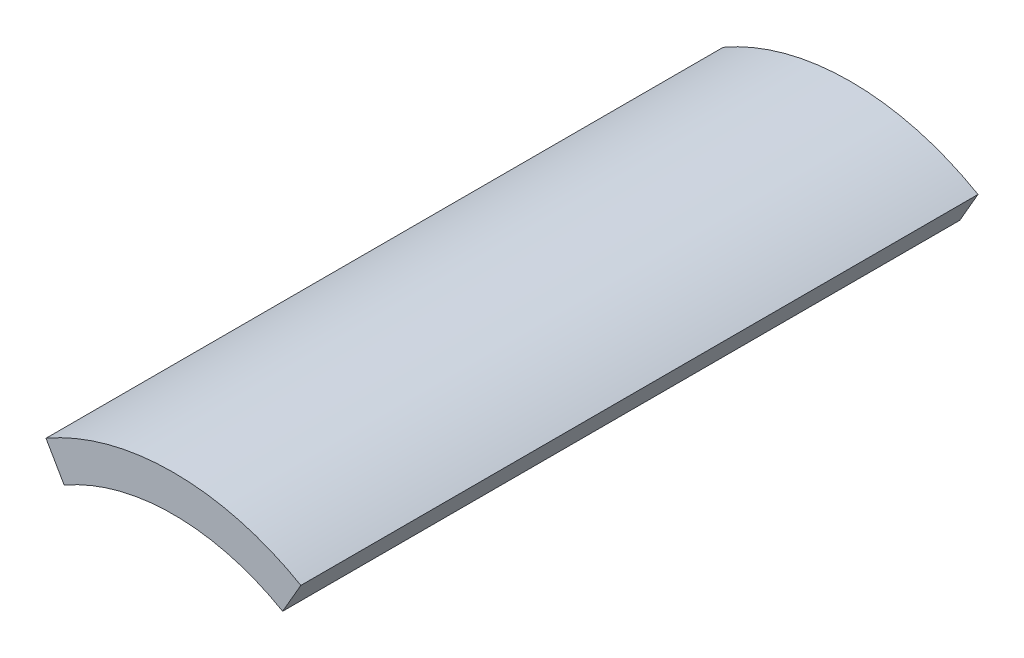
ISO-10303-21;
HEADER;
FILE_DESCRIPTION(('STEP AP214'),'2;1');
FILE_NAME('part.step','',(''),(''),'','','');
FILE_SCHEMA(('AUTOMOTIVE_DESIGN { 1 0 10303 214 1 1 1 1 }'));
ENDSEC;
DATA;
#1=APPLICATION_CONTEXT('core data for automotive mechanical design processes');
#2=APPLICATION_PROTOCOL_DEFINITION('international standard','automotive_design',2000,#1);
#3=PRODUCT_CONTEXT('',#1,'mechanical');
#4=PRODUCT('Part','Part','',(#3));
#5=PRODUCT_RELATED_PRODUCT_CATEGORY('part','',(#4));
#6=PRODUCT_DEFINITION_FORMATION('','',#4);
#7=PRODUCT_DEFINITION_CONTEXT('part definition',#1,'design');
#8=PRODUCT_DEFINITION('design','',#6,#7);
#9=PRODUCT_DEFINITION_SHAPE('','',#8);
#10=(LENGTH_UNIT() NAMED_UNIT(*) SI_UNIT(.MILLI.,.METRE.));
#11=(NAMED_UNIT(*) PLANE_ANGLE_UNIT() SI_UNIT($,.RADIAN.));
#12=(NAMED_UNIT(*) SI_UNIT($,.STERADIAN.) SOLID_ANGLE_UNIT());
#13=UNCERTAINTY_MEASURE_WITH_UNIT(LENGTH_MEASURE(1.E-05),#10,'distance_accuracy_value','');
#14=(GEOMETRIC_REPRESENTATION_CONTEXT(3) GLOBAL_UNCERTAINTY_ASSIGNED_CONTEXT((#13)) GLOBAL_UNIT_ASSIGNED_CONTEXT((#10,
#11,#12)) REPRESENTATION_CONTEXT('',''));
#15=CARTESIAN_POINT('',(0.,0.,0.));
#16=DIRECTION('',(0.,0.,1.));
#17=DIRECTION('',(1.,0.,0.));
#18=AXIS2_PLACEMENT_3D('',#15,#16,#17);
#19=CARTESIAN_POINT('',(0.,0.,59.055));
#20=DIRECTION('',(0.,0.,-1.));
#21=DIRECTION('',(-1.,0.,0.));
#22=AXIS2_PLACEMENT_3D('',#19,#20,#21);
#23=CYLINDRICAL_SURFACE('',#22,22.225);
#24=CARTESIAN_POINT('',(0.,0.,0.));
#25=DIRECTION('',(0.,0.,1.));
#26=DIRECTION('',(1.,0.,0.));
#27=AXIS2_PLACEMENT_3D('',#24,#25,#26);
#28=CIRCLE('',#27,22.225);
#29=CARTESIAN_POINT('',(-11.1125,19.2474145991092,0.));
#30=VERTEX_POINT('',#29);
#31=CARTESIAN_POINT('',(11.1125,19.2474145991092,0.));
#32=VERTEX_POINT('',#31);
#33=EDGE_CURVE('E100',#30,#32,#28,.F.);
#34=ORIENTED_EDGE('',*,*,#33,.F.);
#35=DIRECTION('',(0.,0.,-1.));
#36=VECTOR('',#35,1.);
#37=CARTESIAN_POINT('',(-11.1125,19.2474145991092,59.055));
#38=LINE('',#37,#36);
#39=CARTESIAN_POINT('',(-11.1125,19.2474145991092,59.055));
#40=VERTEX_POINT('',#39);
#41=EDGE_CURVE('E11',#40,#30,#38,.T.);
#42=ORIENTED_EDGE('',*,*,#41,.F.);
#43=CARTESIAN_POINT('',(0.,0.,59.055));
#44=DIRECTION('',(0.,0.,1.));
#45=DIRECTION('',(1.,0.,0.));
#46=AXIS2_PLACEMENT_3D('',#43,#44,#45);
#47=CIRCLE('',#46,22.225);
#48=CARTESIAN_POINT('',(11.1125,19.2474145991092,59.055));
#49=VERTEX_POINT('',#48);
#50=EDGE_CURVE('E94',#40,#49,#47,.F.);
#51=ORIENTED_EDGE('',*,*,#50,.T.);
#52=DIRECTION('',(0.,0.,-1.));
#53=VECTOR('',#52,1.);
#54=CARTESIAN_POINT('',(11.1125,19.2474145991092,59.055));
#55=LINE('',#54,#53);
#56=EDGE_CURVE('E52',#49,#32,#55,.T.);
#57=ORIENTED_EDGE('',*,*,#56,.T.);
#58=EDGE_LOOP('',(#34,#42,#51,#57));
#59=FACE_BOUND('',#58,.T.);
#60=ADVANCED_FACE('F36',(#59),#23,.T.);
#61=CARTESIAN_POINT('',(0.,0.,59.055));
#62=DIRECTION('',(-0.866025403784439,-0.5,0.));
#63=DIRECTION('',(0.5,-0.866025403784439,0.));
#64=AXIS2_PLACEMENT_3D('',#61,#62,#63);
#65=PLANE('',#64);
#66=DIRECTION('',(-0.5,0.866025403784439,0.));
#67=VECTOR('',#66,1.);
#68=CARTESIAN_POINT('',(0.,0.,0.));
#69=LINE('',#68,#67);
#70=CARTESIAN_POINT('',(-9.525,16.4977839420936,0.));
#71=VERTEX_POINT('',#70);
#72=EDGE_CURVE('E84',#71,#30,#69,.T.);
#73=ORIENTED_EDGE('',*,*,#72,.F.);
#74=DIRECTION('',(0.,0.,-1.));
#75=VECTOR('',#74,1.);
#76=CARTESIAN_POINT('',(-9.525,16.4977839420936,59.055));
#77=LINE('',#76,#75);
#78=CARTESIAN_POINT('',(-9.525,16.4977839420936,59.055));
#79=VERTEX_POINT('',#78);
#80=EDGE_CURVE('E44',#79,#71,#77,.T.);
#81=ORIENTED_EDGE('',*,*,#80,.F.);
#82=DIRECTION('',(-0.5,0.866025403784439,0.));
#83=VECTOR('',#82,1.);
#84=CARTESIAN_POINT('',(0.,0.,59.055));
#85=LINE('',#84,#83);
#86=EDGE_CURVE('E82',#79,#40,#85,.T.);
#87=ORIENTED_EDGE('',*,*,#86,.T.);
#88=ORIENTED_EDGE('',*,*,#41,.T.);
#89=EDGE_LOOP('',(#73,#81,#87,#88));
#90=FACE_BOUND('',#89,.T.);
#91=ADVANCED_FACE('F80',(#90),#65,.T.);
#92=CARTESIAN_POINT('',(0.,0.,59.055));
#93=DIRECTION('',(0.,0.,-1.));
#94=DIRECTION('',(-1.,0.,0.));
#95=AXIS2_PLACEMENT_3D('',#92,#93,#94);
#96=CYLINDRICAL_SURFACE('',#95,19.05);
#97=CARTESIAN_POINT('',(0.,0.,0.));
#98=DIRECTION('',(0.,0.,1.));
#99=DIRECTION('',(1.,0.,0.));
#100=AXIS2_PLACEMENT_3D('',#97,#98,#99);
#101=CIRCLE('',#100,19.05);
#102=CARTESIAN_POINT('',(9.525,16.4977839420936,0.));
#103=VERTEX_POINT('',#102);
#104=EDGE_CURVE('E103',#71,#103,#101,.F.);
#105=ORIENTED_EDGE('',*,*,#104,.T.);
#106=DIRECTION('',(0.,0.,-1.));
#107=VECTOR('',#106,1.);
#108=CARTESIAN_POINT('',(9.525,16.4977839420936,59.055));
#109=LINE('',#108,#107);
#110=CARTESIAN_POINT('',(9.525,16.4977839420936,59.055));
#111=VERTEX_POINT('',#110);
#112=EDGE_CURVE('E66',#111,#103,#109,.T.);
#113=ORIENTED_EDGE('',*,*,#112,.F.);
#114=CARTESIAN_POINT('',(0.,0.,59.055));
#115=DIRECTION('',(0.,0.,1.));
#116=DIRECTION('',(1.,0.,0.));
#117=AXIS2_PLACEMENT_3D('',#114,#115,#116);
#118=CIRCLE('',#117,19.05);
#119=EDGE_CURVE('E87',#79,#111,#118,.F.);
#120=ORIENTED_EDGE('',*,*,#119,.F.);
#121=ORIENTED_EDGE('',*,*,#80,.T.);
#122=EDGE_LOOP('',(#105,#113,#120,#121));
#123=FACE_BOUND('',#122,.T.);
#124=ADVANCED_FACE('F88',(#123),#96,.F.);
#125=CARTESIAN_POINT('',(0.,0.,59.055));
#126=DIRECTION('',(0.866025403784439,-0.5,0.));
#127=DIRECTION('',(0.5,0.866025403784439,0.));
#128=AXIS2_PLACEMENT_3D('',#125,#126,#127);
#129=PLANE('',#128);
#130=DIRECTION('',(-0.5,-0.866025403784439,0.));
#131=VECTOR('',#130,1.);
#132=CARTESIAN_POINT('',(0.,0.,0.));
#133=LINE('',#132,#131);
#134=EDGE_CURVE('E96',#32,#103,#133,.T.);
#135=ORIENTED_EDGE('',*,*,#134,.F.);
#136=ORIENTED_EDGE('',*,*,#56,.F.);
#137=DIRECTION('',(-0.5,-0.866025403784439,0.));
#138=VECTOR('',#137,1.);
#139=CARTESIAN_POINT('',(0.,0.,59.055));
#140=LINE('',#139,#138);
#141=EDGE_CURVE('E91',#49,#111,#140,.T.);
#142=ORIENTED_EDGE('',*,*,#141,.T.);
#143=ORIENTED_EDGE('',*,*,#112,.T.);
#144=EDGE_LOOP('',(#135,#136,#142,#143));
#145=FACE_BOUND('',#144,.T.);
#146=ADVANCED_FACE('F110',(#145),#129,.T.);
#147=CARTESIAN_POINT('',(0.,0.,59.055));
#148=DIRECTION('',(0.,0.,1.));
#149=DIRECTION('',(1.,0.,0.));
#150=AXIS2_PLACEMENT_3D('',#147,#148,#149);
#151=PLANE('',#150);
#152=ORIENTED_EDGE('',*,*,#50,.F.);
#153=ORIENTED_EDGE('',*,*,#86,.F.);
#154=ORIENTED_EDGE('',*,*,#119,.T.);
#155=ORIENTED_EDGE('',*,*,#141,.F.);
#156=EDGE_LOOP('',(#152,#153,#154,#155));
#157=FACE_BOUND('',#156,.T.);
#158=ADVANCED_FACE('F93',(#157),#151,.T.);
#159=CARTESIAN_POINT('',(0.,0.,0.));
#160=DIRECTION('',(0.,0.,1.));
#161=DIRECTION('',(1.,0.,0.));
#162=AXIS2_PLACEMENT_3D('',#159,#160,#161);
#163=PLANE('',#162);
#164=ORIENTED_EDGE('',*,*,#33,.T.);
#165=ORIENTED_EDGE('',*,*,#134,.T.);
#166=ORIENTED_EDGE('',*,*,#104,.F.);
#167=ORIENTED_EDGE('',*,*,#72,.T.);
#168=EDGE_LOOP('',(#164,#165,#166,#167));
#169=FACE_BOUND('',#168,.T.);
#170=ADVANCED_FACE('F109',(#169),#163,.F.);
#171=CLOSED_SHELL('',(#60,#91,#124,#146,#158,#170));
#172=MANIFOLD_SOLID_BREP('B2',#171);
#173=ADVANCED_BREP_SHAPE_REPRESENTATION('',(#18,#172),#14);
#174=SHAPE_DEFINITION_REPRESENTATION(#9,#173);
ENDSEC;
END-ISO-10303-21;
